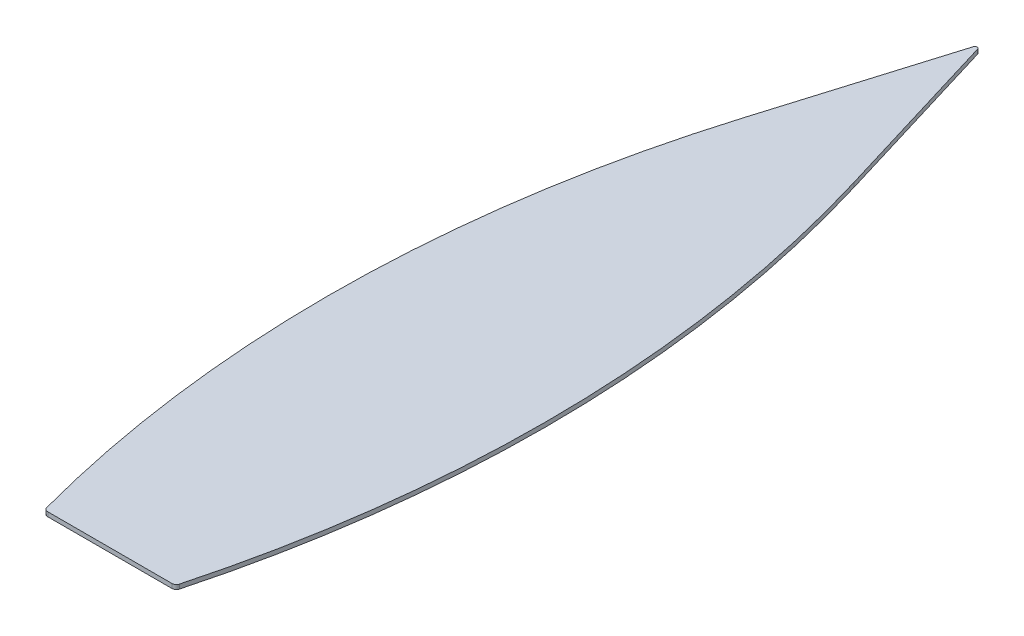
ISO-10303-21;
HEADER;
FILE_DESCRIPTION(('STEP AP214'),'2;1');
FILE_NAME('part.step','',(''),(''),'','','');
FILE_SCHEMA(('AUTOMOTIVE_DESIGN { 1 0 10303 214 1 1 1 1 }'));
ENDSEC;
DATA;
#1=APPLICATION_CONTEXT('core data for automotive mechanical design processes');
#2=APPLICATION_PROTOCOL_DEFINITION('international standard','automotive_design',2000,#1);
#3=PRODUCT_CONTEXT('',#1,'mechanical');
#4=PRODUCT('Part','Part','',(#3));
#5=PRODUCT_RELATED_PRODUCT_CATEGORY('part','',(#4));
#6=PRODUCT_DEFINITION_FORMATION('','',#4);
#7=PRODUCT_DEFINITION_CONTEXT('part definition',#1,'design');
#8=PRODUCT_DEFINITION('design','',#6,#7);
#9=PRODUCT_DEFINITION_SHAPE('','',#8);
#10=(LENGTH_UNIT() NAMED_UNIT(*) SI_UNIT(.MILLI.,.METRE.));
#11=(NAMED_UNIT(*) PLANE_ANGLE_UNIT() SI_UNIT($,.RADIAN.));
#12=(NAMED_UNIT(*) SI_UNIT($,.STERADIAN.) SOLID_ANGLE_UNIT());
#13=UNCERTAINTY_MEASURE_WITH_UNIT(LENGTH_MEASURE(1.E-05),#10,'distance_accuracy_value','');
#14=(GEOMETRIC_REPRESENTATION_CONTEXT(3) GLOBAL_UNCERTAINTY_ASSIGNED_CONTEXT((#13)) GLOBAL_UNIT_ASSIGNED_CONTEXT((#10,
#11,#12)) REPRESENTATION_CONTEXT('',''));
#15=CARTESIAN_POINT('',(0.,0.,0.));
#16=DIRECTION('',(0.,0.,1.));
#17=DIRECTION('',(1.,0.,0.));
#18=AXIS2_PLACEMENT_3D('',#15,#16,#17);
#19=CARTESIAN_POINT('',(1306.25,5.,125.));
#20=DIRECTION('',(0.,-1.,0.));
#21=DIRECTION('',(0.,0.,-1.));
#22=AXIS2_PLACEMENT_3D('',#19,#20,#21);
#23=CYLINDRICAL_SURFACE('',#22,1431.25);
#24=CARTESIAN_POINT('',(1306.25,0.,125.));
#25=DIRECTION('',(0.,1.,0.));
#26=DIRECTION('',(0.,0.,-1.));
#27=AXIS2_PLACEMENT_3D('',#24,#25,#26);
#28=CIRCLE('',#27,1431.25);
#29=CARTESIAN_POINT('',(-63.7134428689835,0.,-289.338904403824));
#30=VERTEX_POINT('',#29);
#31=CARTESIAN_POINT('',(-75.999984713049,0.,496.297107800175));
#32=VERTEX_POINT('',#31);
#33=EDGE_CURVE('E124',#30,#32,#28,.T.);
#34=ORIENTED_EDGE('',*,*,#33,.T.);
#35=DIRECTION('',(0.,-1.,0.));
#36=VECTOR('',#35,1.);
#37=CARTESIAN_POINT('',(-75.9999847130495,5.,496.297107800175));
#38=LINE('',#37,#36);
#39=CARTESIAN_POINT('',(-75.999984713049,5.,496.297107800175));
#40=VERTEX_POINT('',#39);
#41=EDGE_CURVE('E146',#32,#40,#38,.F.);
#42=ORIENTED_EDGE('',*,*,#41,.T.);
#43=CARTESIAN_POINT('',(1306.25,5.,125.));
#44=DIRECTION('',(0.,1.,0.));
#45=DIRECTION('',(0.,0.,-1.));
#46=AXIS2_PLACEMENT_3D('',#43,#44,#45);
#47=CIRCLE('',#46,1431.25);
#48=CARTESIAN_POINT('',(-63.7134428689835,5.,-289.338904403824));
#49=VERTEX_POINT('',#48);
#50=EDGE_CURVE('E135',#49,#40,#47,.T.);
#51=ORIENTED_EDGE('',*,*,#50,.F.);
#52=DIRECTION('',(0.,-1.,0.));
#53=VECTOR('',#52,1.);
#54=CARTESIAN_POINT('',(-63.7134428689835,5.,-289.338904403824));
#55=LINE('',#54,#53);
#56=EDGE_CURVE('E116',#49,#30,#55,.T.);
#57=ORIENTED_EDGE('',*,*,#56,.T.);
#58=EDGE_LOOP('',(#34,#42,#51,#57));
#59=FACE_BOUND('',#58,.T.);
#60=ADVANCED_FACE('F33',(#59),#23,.T.);
#61=CARTESIAN_POINT('',(-75.,5.,500.));
#62=DIRECTION('',(0.,0.,-1.));
#63=DIRECTION('',(-1.,0.,0.));
#64=AXIS2_PLACEMENT_3D('',#61,#62,#63);
#65=PLANE('',#64);
#66=DIRECTION('',(1.,0.,0.));
#67=VECTOR('',#66,1.);
#68=CARTESIAN_POINT('',(-75.,5.,500.));
#69=LINE('',#68,#67);
#70=CARTESIAN_POINT('',(-71.1711638057548,5.,500.));
#71=VERTEX_POINT('',#70);
#72=CARTESIAN_POINT('',(71.1711638057548,5.,500.));
#73=VERTEX_POINT('',#72);
#74=EDGE_CURVE('E108',#71,#73,#69,.T.);
#75=ORIENTED_EDGE('',*,*,#74,.F.);
#76=DIRECTION('',(0.,-1.,0.));
#77=VECTOR('',#76,1.);
#78=CARTESIAN_POINT('',(-71.1711638057548,5.,500.));
#79=LINE('',#78,#77);
#80=CARTESIAN_POINT('',(-71.1711638057548,0.,500.));
#81=VERTEX_POINT('',#80);
#82=EDGE_CURVE('E139',#71,#81,#79,.T.);
#83=ORIENTED_EDGE('',*,*,#82,.T.);
#84=DIRECTION('',(1.,0.,0.));
#85=VECTOR('',#84,1.);
#86=CARTESIAN_POINT('',(-75.,0.,500.));
#87=LINE('',#86,#85);
#88=CARTESIAN_POINT('',(71.1711638057548,0.,500.));
#89=VERTEX_POINT('',#88);
#90=EDGE_CURVE('E127',#81,#89,#87,.T.);
#91=ORIENTED_EDGE('',*,*,#90,.T.);
#92=DIRECTION('',(0.,-1.,0.));
#93=VECTOR('',#92,1.);
#94=CARTESIAN_POINT('',(71.1711638057548,5.,500.));
#95=LINE('',#94,#93);
#96=EDGE_CURVE('E115',#89,#73,#95,.F.);
#97=ORIENTED_EDGE('',*,*,#96,.T.);
#98=EDGE_LOOP('',(#75,#83,#91,#97));
#99=FACE_BOUND('',#98,.T.);
#100=ADVANCED_FACE('F175',(#99),#65,.F.);
#101=CARTESIAN_POINT('',(-1306.25,5.,125.));
#102=DIRECTION('',(0.,-1.,0.));
#103=DIRECTION('',(0.,0.,-1.));
#104=AXIS2_PLACEMENT_3D('',#101,#102,#103);
#105=CYLINDRICAL_SURFACE('',#104,1431.25);
#106=CARTESIAN_POINT('',(-1306.25,5.,125.));
#107=DIRECTION('',(0.,1.,0.));
#108=DIRECTION('',(0.,0.,-1.));
#109=AXIS2_PLACEMENT_3D('',#106,#107,#108);
#110=CIRCLE('',#109,1431.25);
#111=CARTESIAN_POINT('',(75.9999847130493,5.,496.297107800175));
#112=VERTEX_POINT('',#111);
#113=CARTESIAN_POINT('',(63.7134428689836,5.,-289.338904403824));
#114=VERTEX_POINT('',#113);
#115=EDGE_CURVE('E97',#112,#114,#110,.T.);
#116=ORIENTED_EDGE('',*,*,#115,.F.);
#117=DIRECTION('',(0.,-1.,0.));
#118=VECTOR('',#117,1.);
#119=CARTESIAN_POINT('',(75.9999847130495,5.,496.297107800175));
#120=LINE('',#119,#118);
#121=CARTESIAN_POINT('',(75.9999847130493,0.,496.297107800175));
#122=VERTEX_POINT('',#121);
#123=EDGE_CURVE('E151',#112,#122,#120,.T.);
#124=ORIENTED_EDGE('',*,*,#123,.T.);
#125=CARTESIAN_POINT('',(-1306.25,0.,125.));
#126=DIRECTION('',(0.,1.,0.));
#127=DIRECTION('',(0.,0.,-1.));
#128=AXIS2_PLACEMENT_3D('',#125,#126,#127);
#129=CIRCLE('',#128,1431.25);
#130=CARTESIAN_POINT('',(63.7134428689836,0.,-289.338904403824));
#131=VERTEX_POINT('',#130);
#132=EDGE_CURVE('E114',#122,#131,#129,.T.);
#133=ORIENTED_EDGE('',*,*,#132,.T.);
#134=DIRECTION('',(0.,-1.,0.));
#135=VECTOR('',#134,1.);
#136=CARTESIAN_POINT('',(63.7134428689836,5.,-289.338904403824));
#137=LINE('',#136,#135);
#138=EDGE_CURVE('E111',#114,#131,#137,.T.);
#139=ORIENTED_EDGE('',*,*,#138,.F.);
#140=EDGE_LOOP('',(#116,#124,#133,#139));
#141=FACE_BOUND('',#140,.T.);
#142=ADVANCED_FACE('F112',(#141),#105,.T.);
#143=CARTESIAN_POINT('',(0.,5.,-500.));
#144=DIRECTION('',(-0.957179698074399,0.,0.289494431024507));
#145=DIRECTION('',(0.289494431024507,0.,0.957179698074399));
#146=AXIS2_PLACEMENT_3D('',#143,#144,#145);
#147=PLANE('',#146);
#148=DIRECTION('',(-0.289494431024507,0.,-0.957179698074399));
#149=VECTOR('',#148,1.);
#150=CARTESIAN_POINT('',(0.,0.,-500.));
#151=LINE('',#150,#149);
#152=CARTESIAN_POINT('',(2.39294924518602,0.,-492.087991372032));
#153=VERTEX_POINT('',#152);
#154=EDGE_CURVE('E131',#131,#153,#151,.T.);
#155=ORIENTED_EDGE('',*,*,#154,.T.);
#156=DIRECTION('',(0.,-1.,0.));
#157=VECTOR('',#156,1.);
#158=CARTESIAN_POINT('',(2.39294924518602,5.,-492.087991372032));
#159=LINE('',#158,#157);
#160=CARTESIAN_POINT('',(2.39294924518602,5.,-492.087991372032));
#161=VERTEX_POINT('',#160);
#162=EDGE_CURVE('E41',#153,#161,#159,.F.);
#163=ORIENTED_EDGE('',*,*,#162,.T.);
#164=DIRECTION('',(-0.289494431024507,0.,-0.957179698074399));
#165=VECTOR('',#164,1.);
#166=CARTESIAN_POINT('',(0.,5.,-500.));
#167=LINE('',#166,#165);
#168=EDGE_CURVE('E100',#114,#161,#167,.T.);
#169=ORIENTED_EDGE('',*,*,#168,.F.);
#170=ORIENTED_EDGE('',*,*,#138,.T.);
#171=EDGE_LOOP('',(#155,#163,#169,#170));
#172=FACE_BOUND('',#171,.T.);
#173=ADVANCED_FACE('F118',(#172),#147,.F.);
#174=CARTESIAN_POINT('',(-63.7134428689835,5.,-289.338904403824));
#175=DIRECTION('',(0.957179698074399,0.,0.289494431024506));
#176=DIRECTION('',(0.289494431024506,0.,-0.957179698074399));
#177=AXIS2_PLACEMENT_3D('',#174,#175,#176);
#178=PLANE('',#177);
#179=DIRECTION('',(-0.289494431024506,0.,0.957179698074399));
#180=VECTOR('',#179,1.);
#181=CARTESIAN_POINT('',(-63.7134428689835,5.,-289.338904403824));
#182=LINE('',#181,#180);
#183=CARTESIAN_POINT('',(-2.39294924518602,5.,-492.087991372032));
#184=VERTEX_POINT('',#183);
#185=EDGE_CURVE('E119',#184,#49,#182,.T.);
#186=ORIENTED_EDGE('',*,*,#185,.F.);
#187=DIRECTION('',(0.,-1.,0.));
#188=VECTOR('',#187,1.);
#189=CARTESIAN_POINT('',(-2.392949245186,5.,-492.087991372032));
#190=LINE('',#189,#188);
#191=CARTESIAN_POINT('',(-2.39294924518602,0.,-492.087991372032));
#192=VERTEX_POINT('',#191);
#193=EDGE_CURVE('E153',#184,#192,#190,.T.);
#194=ORIENTED_EDGE('',*,*,#193,.T.);
#195=DIRECTION('',(-0.289494431024506,0.,0.957179698074399));
#196=VECTOR('',#195,1.);
#197=CARTESIAN_POINT('',(-63.7134428689835,0.,-289.338904403824));
#198=LINE('',#197,#196);
#199=EDGE_CURVE('E133',#192,#30,#198,.T.);
#200=ORIENTED_EDGE('',*,*,#199,.T.);
#201=ORIENTED_EDGE('',*,*,#56,.F.);
#202=EDGE_LOOP('',(#186,#194,#200,#201));
#203=FACE_BOUND('',#202,.T.);
#204=ADVANCED_FACE('F159',(#203),#178,.F.);
#205=CARTESIAN_POINT('',(1306.25,5.,125.));
#206=DIRECTION('',(0.,-1.,0.));
#207=DIRECTION('',(0.,0.,-1.));
#208=AXIS2_PLACEMENT_3D('',#205,#206,#207);
#209=PLANE('',#208);
#210=ORIENTED_EDGE('',*,*,#168,.T.);
#211=CARTESIAN_POINT('',(0.,5.,-491.364255294471));
#212=DIRECTION('',(0.,-1.,0.));
#213=DIRECTION('',(0.,0.,-1.));
#214=AXIS2_PLACEMENT_3D('',#211,#212,#213);
#215=CIRCLE('',#214,2.5);
#216=EDGE_CURVE('E11',#161,#184,#215,.F.);
#217=ORIENTED_EDGE('',*,*,#216,.T.);
#218=ORIENTED_EDGE('',*,*,#185,.T.);
#219=ORIENTED_EDGE('',*,*,#50,.T.);
#220=CARTESIAN_POINT('',(-71.1711638057548,5.,495.));
#221=DIRECTION('',(0.,-1.,0.));
#222=DIRECTION('',(0.,0.,-1.));
#223=AXIS2_PLACEMENT_3D('',#220,#221,#222);
#224=CIRCLE('',#223,5.);
#225=EDGE_CURVE('E149',#40,#71,#224,.F.);
#226=ORIENTED_EDGE('',*,*,#225,.T.);
#227=ORIENTED_EDGE('',*,*,#74,.T.);
#228=CARTESIAN_POINT('',(71.1711638057548,5.,495.));
#229=DIRECTION('',(0.,-1.,0.));
#230=DIRECTION('',(0.,0.,-1.));
#231=AXIS2_PLACEMENT_3D('',#228,#229,#230);
#232=CIRCLE('',#231,5.);
#233=EDGE_CURVE('E104',#73,#112,#232,.F.);
#234=ORIENTED_EDGE('',*,*,#233,.T.);
#235=ORIENTED_EDGE('',*,*,#115,.T.);
#236=EDGE_LOOP('',(#210,#217,#218,#219,#226,#227,#234,#235));
#237=FACE_BOUND('',#236,.T.);
#238=ADVANCED_FACE('F99',(#237),#209,.F.);
#239=CARTESIAN_POINT('',(1306.25,0.,125.));
#240=DIRECTION('',(0.,-1.,0.));
#241=DIRECTION('',(0.,0.,-1.));
#242=AXIS2_PLACEMENT_3D('',#239,#240,#241);
#243=PLANE('',#242);
#244=ORIENTED_EDGE('',*,*,#199,.F.);
#245=CARTESIAN_POINT('',(0.,0.,-491.364255294471));
#246=DIRECTION('',(0.,-1.,0.));
#247=DIRECTION('',(0.,0.,-1.));
#248=AXIS2_PLACEMENT_3D('',#245,#246,#247);
#249=CIRCLE('',#248,2.5);
#250=EDGE_CURVE('E55',#192,#153,#249,.T.);
#251=ORIENTED_EDGE('',*,*,#250,.T.);
#252=ORIENTED_EDGE('',*,*,#154,.F.);
#253=ORIENTED_EDGE('',*,*,#132,.F.);
#254=CARTESIAN_POINT('',(71.1711638057548,0.,495.));
#255=DIRECTION('',(0.,-1.,0.));
#256=DIRECTION('',(0.,0.,-1.));
#257=AXIS2_PLACEMENT_3D('',#254,#255,#256);
#258=CIRCLE('',#257,5.);
#259=EDGE_CURVE('E142',#122,#89,#258,.T.);
#260=ORIENTED_EDGE('',*,*,#259,.T.);
#261=ORIENTED_EDGE('',*,*,#90,.F.);
#262=CARTESIAN_POINT('',(-71.1711638057548,0.,495.));
#263=DIRECTION('',(0.,-1.,0.));
#264=DIRECTION('',(0.,0.,-1.));
#265=AXIS2_PLACEMENT_3D('',#262,#263,#264);
#266=CIRCLE('',#265,5.);
#267=EDGE_CURVE('E144',#81,#32,#266,.T.);
#268=ORIENTED_EDGE('',*,*,#267,.T.);
#269=ORIENTED_EDGE('',*,*,#33,.F.);
#270=EDGE_LOOP('',(#244,#251,#252,#253,#260,#261,#268,#269));
#271=FACE_BOUND('',#270,.T.);
#272=ADVANCED_FACE('F163',(#271),#243,.T.);
#273=CARTESIAN_POINT('',(-71.1711638057548,5.,495.));
#274=DIRECTION('',(0.,-1.,0.));
#275=DIRECTION('',(0.,0.,-1.));
#276=AXIS2_PLACEMENT_3D('',#273,#274,#275);
#277=CYLINDRICAL_SURFACE('',#276,5.);
#278=ORIENTED_EDGE('',*,*,#225,.F.);
#279=ORIENTED_EDGE('',*,*,#41,.F.);
#280=ORIENTED_EDGE('',*,*,#267,.F.);
#281=ORIENTED_EDGE('',*,*,#82,.F.);
#282=EDGE_LOOP('',(#278,#279,#280,#281));
#283=FACE_BOUND('',#282,.T.);
#284=ADVANCED_FACE('F171',(#283),#277,.T.);
#285=CARTESIAN_POINT('',(71.1711638057548,5.,495.));
#286=DIRECTION('',(0.,-1.,0.));
#287=DIRECTION('',(0.,0.,-1.));
#288=AXIS2_PLACEMENT_3D('',#285,#286,#287);
#289=CYLINDRICAL_SURFACE('',#288,5.);
#290=ORIENTED_EDGE('',*,*,#233,.F.);
#291=ORIENTED_EDGE('',*,*,#96,.F.);
#292=ORIENTED_EDGE('',*,*,#259,.F.);
#293=ORIENTED_EDGE('',*,*,#123,.F.);
#294=EDGE_LOOP('',(#290,#291,#292,#293));
#295=FACE_BOUND('',#294,.T.);
#296=ADVANCED_FACE('F179',(#295),#289,.T.);
#297=CARTESIAN_POINT('',(0.,5.,-491.364255294471));
#298=DIRECTION('',(0.,-1.,0.));
#299=DIRECTION('',(0.,0.,-1.));
#300=AXIS2_PLACEMENT_3D('',#297,#298,#299);
#301=CYLINDRICAL_SURFACE('',#300,2.5);
#302=ORIENTED_EDGE('',*,*,#216,.F.);
#303=ORIENTED_EDGE('',*,*,#162,.F.);
#304=ORIENTED_EDGE('',*,*,#250,.F.);
#305=ORIENTED_EDGE('',*,*,#193,.F.);
#306=EDGE_LOOP('',(#302,#303,#304,#305));
#307=FACE_BOUND('',#306,.T.);
#308=ADVANCED_FACE('F35',(#307),#301,.T.);
#309=CLOSED_SHELL('',(#60,#100,#142,#173,#204,#238,#272,#284,#296,#308));
#310=MANIFOLD_SOLID_BREP('B2',#309);
#311=ADVANCED_BREP_SHAPE_REPRESENTATION('',(#18,#310),#14);
#312=SHAPE_DEFINITION_REPRESENTATION(#9,#311);
ENDSEC;
END-ISO-10303-21;
